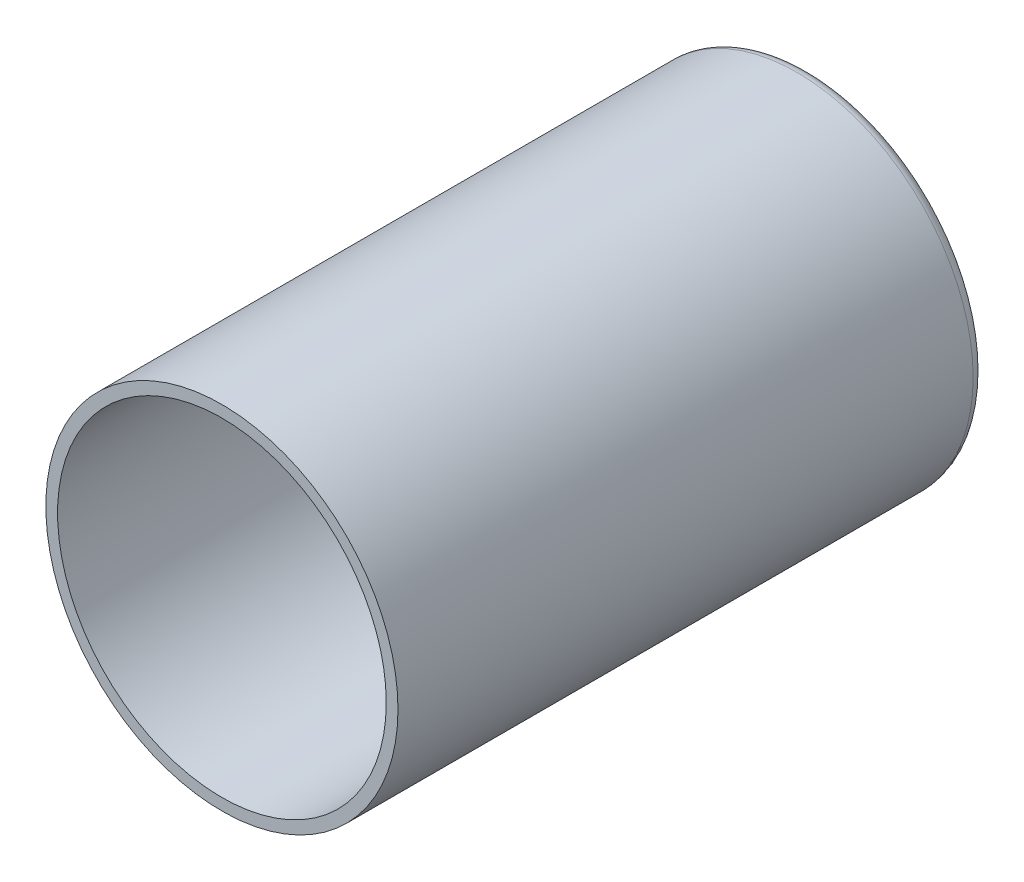
ISO-10303-21;
HEADER;
FILE_DESCRIPTION(('STEP AP214'),'2;1');
FILE_NAME('part.step','',(''),(''),'','','');
FILE_SCHEMA(('AUTOMOTIVE_DESIGN { 1 0 10303 214 1 1 1 1 }'));
ENDSEC;
DATA;
#1=APPLICATION_CONTEXT('core data for automotive mechanical design processes');
#2=APPLICATION_PROTOCOL_DEFINITION('international standard','automotive_design',2000,#1);
#3=PRODUCT_CONTEXT('',#1,'mechanical');
#4=PRODUCT('Part','Part','',(#3));
#5=PRODUCT_RELATED_PRODUCT_CATEGORY('part','',(#4));
#6=PRODUCT_DEFINITION_FORMATION('','',#4);
#7=PRODUCT_DEFINITION_CONTEXT('part definition',#1,'design');
#8=PRODUCT_DEFINITION('design','',#6,#7);
#9=PRODUCT_DEFINITION_SHAPE('','',#8);
#10=(LENGTH_UNIT() NAMED_UNIT(*) SI_UNIT(.MILLI.,.METRE.));
#11=(NAMED_UNIT(*) PLANE_ANGLE_UNIT() SI_UNIT($,.RADIAN.));
#12=(NAMED_UNIT(*) SI_UNIT($,.STERADIAN.) SOLID_ANGLE_UNIT());
#13=UNCERTAINTY_MEASURE_WITH_UNIT(LENGTH_MEASURE(1.E-05),#10,'distance_accuracy_value','');
#14=(GEOMETRIC_REPRESENTATION_CONTEXT(3) GLOBAL_UNCERTAINTY_ASSIGNED_CONTEXT((#13)) GLOBAL_UNIT_ASSIGNED_CONTEXT((#10,
#11,#12)) REPRESENTATION_CONTEXT('',''));
#15=CARTESIAN_POINT('',(0.,0.,0.));
#16=DIRECTION('',(0.,0.,1.));
#17=DIRECTION('',(1.,0.,0.));
#18=AXIS2_PLACEMENT_3D('',#15,#16,#17);
#19=CARTESIAN_POINT('',(0.,0.,100.));
#20=DIRECTION('',(0.,0.,-1.));
#21=DIRECTION('',(-1.,0.,0.));
#22=AXIS2_PLACEMENT_3D('',#19,#20,#21);
#23=CYLINDRICAL_SURFACE('',#22,30.);
#24=CARTESIAN_POINT('',(0.,0.,2.));
#25=DIRECTION('',(0.,0.,1.));
#26=DIRECTION('',(1.,0.,0.));
#27=AXIS2_PLACEMENT_3D('',#24,#25,#26);
#28=CIRCLE('',#27,30.);
#29=CARTESIAN_POINT('',(30.,0.,2.));
#30=VERTEX_POINT('',#29);
#31=EDGE_CURVE('E50',#30,#30,#28,.T.);
#32=ORIENTED_EDGE('',*,*,#31,.T.);
#33=EDGE_LOOP('',(#32));
#34=FACE_BOUND('',#33,.T.);
#35=CARTESIAN_POINT('',(0.,0.,100.));
#36=DIRECTION('',(0.,0.,1.));
#37=DIRECTION('',(1.,0.,0.));
#38=AXIS2_PLACEMENT_3D('',#35,#36,#37);
#39=CIRCLE('',#38,30.);
#40=CARTESIAN_POINT('',(30.,0.,100.));
#41=VERTEX_POINT('',#40);
#42=EDGE_CURVE('E55',#41,#41,#39,.T.);
#43=ORIENTED_EDGE('',*,*,#42,.F.);
#44=EDGE_LOOP('',(#43));
#45=FACE_BOUND('',#44,.T.);
#46=ADVANCED_FACE('F37',(#34,#45),#23,.T.);
#47=CARTESIAN_POINT('',(0.,0.,100.));
#48=DIRECTION('',(0.,0.,1.));
#49=DIRECTION('',(1.,0.,0.));
#50=AXIS2_PLACEMENT_3D('',#47,#48,#49);
#51=PLANE('',#50);
#52=CARTESIAN_POINT('',(0.,0.,100.));
#53=DIRECTION('',(0.,0.,1.));
#54=DIRECTION('',(1.,0.,0.));
#55=AXIS2_PLACEMENT_3D('',#52,#53,#54);
#56=CIRCLE('',#55,28.);
#57=CARTESIAN_POINT('',(28.,0.,100.));
#58=VERTEX_POINT('',#57);
#59=EDGE_CURVE('E61',#58,#58,#56,.T.);
#60=ORIENTED_EDGE('',*,*,#59,.F.);
#61=EDGE_LOOP('',(#60));
#62=FACE_BOUND('',#61,.T.);
#63=ORIENTED_EDGE('',*,*,#42,.T.);
#64=EDGE_LOOP('',(#63));
#65=FACE_BOUND('',#64,.T.);
#66=ADVANCED_FACE('F100',(#62,#65),#51,.T.);
#67=CARTESIAN_POINT('',(0.,0.,0.));
#68=DIRECTION('',(0.,0.,1.));
#69=DIRECTION('',(1.,0.,0.));
#70=AXIS2_PLACEMENT_3D('',#67,#68,#69);
#71=PLANE('',#70);
#72=CARTESIAN_POINT('',(0.,0.,0.));
#73=DIRECTION('',(0.,0.,1.));
#74=DIRECTION('',(1.,0.,0.));
#75=AXIS2_PLACEMENT_3D('',#72,#73,#74);
#76=CIRCLE('',#75,10.);
#77=CARTESIAN_POINT('',(10.,0.,0.));
#78=VERTEX_POINT('',#77);
#79=EDGE_CURVE('E10',#78,#78,#76,.F.);
#80=ORIENTED_EDGE('',*,*,#79,.F.);
#81=EDGE_LOOP('',(#80));
#82=FACE_BOUND('',#81,.T.);
#83=CARTESIAN_POINT('',(0.,0.,0.));
#84=DIRECTION('',(0.,0.,1.));
#85=DIRECTION('',(1.,0.,0.));
#86=AXIS2_PLACEMENT_3D('',#83,#84,#85);
#87=CIRCLE('',#86,28.);
#88=CARTESIAN_POINT('',(28.,0.,0.));
#89=VERTEX_POINT('',#88);
#90=EDGE_CURVE('E45',#89,#89,#87,.F.);
#91=ORIENTED_EDGE('',*,*,#90,.T.);
#92=EDGE_LOOP('',(#91));
#93=FACE_BOUND('',#92,.T.);
#94=ADVANCED_FACE('F105',(#82,#93),#71,.F.);
#95=CARTESIAN_POINT('',(0.,0.,100.));
#96=DIRECTION('',(0.,0.,-1.));
#97=DIRECTION('',(-1.,0.,0.));
#98=AXIS2_PLACEMENT_3D('',#95,#96,#97);
#99=CYLINDRICAL_SURFACE('',#98,28.);
#100=ORIENTED_EDGE('',*,*,#59,.T.);
#101=EDGE_LOOP('',(#100));
#102=FACE_BOUND('',#101,.T.);
#103=CARTESIAN_POINT('',(0.,0.,2.));
#104=DIRECTION('',(0.,0.,1.));
#105=DIRECTION('',(1.,0.,0.));
#106=AXIS2_PLACEMENT_3D('',#103,#104,#105);
#107=CIRCLE('',#106,28.);
#108=CARTESIAN_POINT('',(28.,0.,2.));
#109=VERTEX_POINT('',#108);
#110=EDGE_CURVE('E65',#109,#109,#107,.T.);
#111=ORIENTED_EDGE('',*,*,#110,.F.);
#112=EDGE_LOOP('',(#111));
#113=FACE_BOUND('',#112,.T.);
#114=ADVANCED_FACE('F111',(#102,#113),#99,.F.);
#115=CARTESIAN_POINT('',(0.,0.,2.));
#116=DIRECTION('',(0.,0.,1.));
#117=DIRECTION('',(1.,0.,0.));
#118=AXIS2_PLACEMENT_3D('',#115,#116,#117);
#119=PLANE('',#118);
#120=CARTESIAN_POINT('',(0.,0.,2.));
#121=DIRECTION('',(0.,0.,1.));
#122=DIRECTION('',(1.,0.,0.));
#123=AXIS2_PLACEMENT_3D('',#120,#121,#122);
#124=CIRCLE('',#123,2.5);
#125=CARTESIAN_POINT('',(2.5,0.,2.));
#126=VERTEX_POINT('',#125);
#127=EDGE_CURVE('E73',#126,#126,#124,.T.);
#128=ORIENTED_EDGE('',*,*,#127,.F.);
#129=EDGE_LOOP('',(#128));
#130=FACE_BOUND('',#129,.T.);
#131=ORIENTED_EDGE('',*,*,#110,.T.);
#132=EDGE_LOOP('',(#131));
#133=FACE_BOUND('',#132,.T.);
#134=ADVANCED_FACE('F96',(#130,#133),#119,.T.);
#135=CARTESIAN_POINT('',(0.,0.,2.));
#136=DIRECTION('',(0.,0.,1.));
#137=DIRECTION('',(1.,0.,0.));
#138=AXIS2_PLACEMENT_3D('',#135,#136,#137);
#139=TOROIDAL_SURFACE('',#138,28.,2.);
#140=ORIENTED_EDGE('',*,*,#90,.F.);
#141=EDGE_LOOP('',(#140));
#142=FACE_BOUND('',#141,.T.);
#143=ORIENTED_EDGE('',*,*,#31,.F.);
#144=EDGE_LOOP('',(#143));
#145=FACE_BOUND('',#144,.T.);
#146=ADVANCED_FACE('F39',(#142,#145),#139,.T.);
#147=CARTESIAN_POINT('',(0.,0.,-5.));
#148=DIRECTION('',(0.,0.,1.));
#149=DIRECTION('',(1.,0.,0.));
#150=AXIS2_PLACEMENT_3D('',#147,#148,#149);
#151=CYLINDRICAL_SURFACE('',#150,10.);
#152=CARTESIAN_POINT('',(0.,0.,-5.));
#153=DIRECTION('',(0.,0.,-1.));
#154=DIRECTION('',(-1.,0.,0.));
#155=AXIS2_PLACEMENT_3D('',#152,#153,#154);
#156=CIRCLE('',#155,10.);
#157=CARTESIAN_POINT('',(-10.,0.,-5.));
#158=VERTEX_POINT('',#157);
#159=EDGE_CURVE('E69',#158,#158,#156,.T.);
#160=ORIENTED_EDGE('',*,*,#159,.F.);
#161=EDGE_LOOP('',(#160));
#162=FACE_BOUND('',#161,.T.);
#163=ORIENTED_EDGE('',*,*,#79,.T.);
#164=EDGE_LOOP('',(#163));
#165=FACE_BOUND('',#164,.T.);
#166=ADVANCED_FACE('F87',(#162,#165),#151,.T.);
#167=CARTESIAN_POINT('',(0.,0.,-5.));
#168=DIRECTION('',(0.,0.,-1.));
#169=DIRECTION('',(-1.,0.,0.));
#170=AXIS2_PLACEMENT_3D('',#167,#168,#169);
#171=PLANE('',#170);
#172=CARTESIAN_POINT('',(0.,0.,-5.));
#173=DIRECTION('',(0.,0.,-1.));
#174=DIRECTION('',(-1.,0.,0.));
#175=AXIS2_PLACEMENT_3D('',#172,#173,#174);
#176=CIRCLE('',#175,2.5);
#177=CARTESIAN_POINT('',(-2.5,0.,-5.));
#178=VERTEX_POINT('',#177);
#179=EDGE_CURVE('E77',#178,#178,#176,.T.);
#180=ORIENTED_EDGE('',*,*,#179,.F.);
#181=EDGE_LOOP('',(#180));
#182=FACE_BOUND('',#181,.T.);
#183=ORIENTED_EDGE('',*,*,#159,.T.);
#184=EDGE_LOOP('',(#183));
#185=FACE_BOUND('',#184,.T.);
#186=ADVANCED_FACE('F84',(#182,#185),#171,.T.);
#187=CARTESIAN_POINT('',(0.,0.,100.));
#188=DIRECTION('',(0.,0.,-1.));
#189=DIRECTION('',(-1.,0.,0.));
#190=AXIS2_PLACEMENT_3D('',#187,#188,#189);
#191=CYLINDRICAL_SURFACE('',#190,2.5);
#192=ORIENTED_EDGE('',*,*,#127,.T.);
#193=EDGE_LOOP('',(#192));
#194=FACE_BOUND('',#193,.T.);
#195=ORIENTED_EDGE('',*,*,#179,.T.);
#196=EDGE_LOOP('',(#195));
#197=FACE_BOUND('',#196,.T.);
#198=ADVANCED_FACE('F82',(#194,#197),#191,.F.);
#199=CLOSED_SHELL('',(#46,#66,#94,#114,#134,#146,#166,#186,#198));
#200=MANIFOLD_SOLID_BREP('B2',#199);
#201=ADVANCED_BREP_SHAPE_REPRESENTATION('',(#18,#200),#14);
#202=SHAPE_DEFINITION_REPRESENTATION(#9,#201);
ENDSEC;
END-ISO-10303-21;
